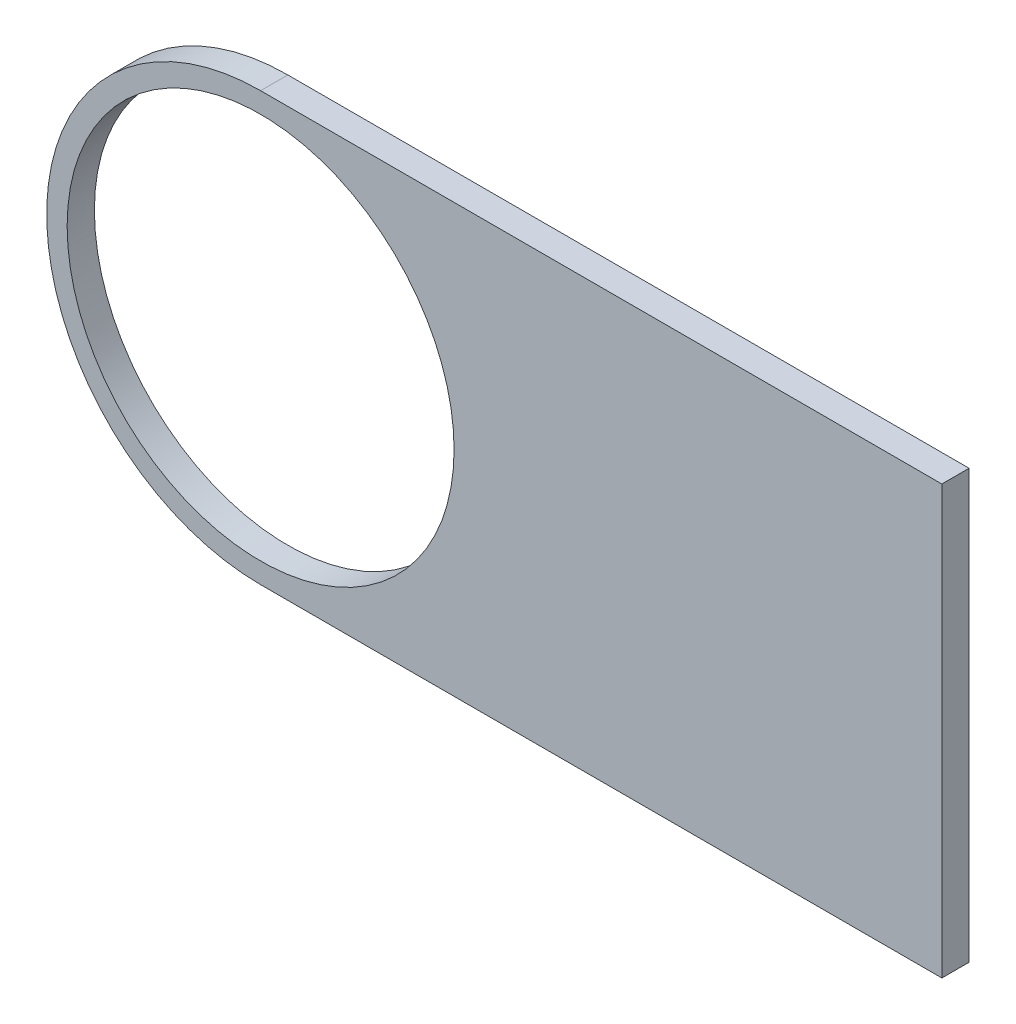
ISO-10303-21;
HEADER;
FILE_DESCRIPTION(('STEP AP214'),'2;1');
FILE_NAME('part.step','',(''),(''),'','','');
FILE_SCHEMA(('AUTOMOTIVE_DESIGN { 1 0 10303 214 1 1 1 1 }'));
ENDSEC;
DATA;
#1=APPLICATION_CONTEXT('core data for automotive mechanical design processes');
#2=APPLICATION_PROTOCOL_DEFINITION('international standard','automotive_design',2000,#1);
#3=PRODUCT_CONTEXT('',#1,'mechanical');
#4=PRODUCT('Part','Part','',(#3));
#5=PRODUCT_RELATED_PRODUCT_CATEGORY('part','',(#4));
#6=PRODUCT_DEFINITION_FORMATION('','',#4);
#7=PRODUCT_DEFINITION_CONTEXT('part definition',#1,'design');
#8=PRODUCT_DEFINITION('design','',#6,#7);
#9=PRODUCT_DEFINITION_SHAPE('','',#8);
#10=(LENGTH_UNIT() NAMED_UNIT(*) SI_UNIT(.MILLI.,.METRE.));
#11=(NAMED_UNIT(*) PLANE_ANGLE_UNIT() SI_UNIT($,.RADIAN.));
#12=(NAMED_UNIT(*) SI_UNIT($,.STERADIAN.) SOLID_ANGLE_UNIT());
#13=UNCERTAINTY_MEASURE_WITH_UNIT(LENGTH_MEASURE(1.E-05),#10,'distance_accuracy_value','');
#14=(GEOMETRIC_REPRESENTATION_CONTEXT(3) GLOBAL_UNCERTAINTY_ASSIGNED_CONTEXT((#13)) GLOBAL_UNIT_ASSIGNED_CONTEXT((#10,
#11,#12)) REPRESENTATION_CONTEXT('',''));
#15=CARTESIAN_POINT('',(0.,0.,0.));
#16=DIRECTION('',(0.,0.,1.));
#17=DIRECTION('',(1.,0.,0.));
#18=AXIS2_PLACEMENT_3D('',#15,#16,#17);
#19=CARTESIAN_POINT('',(0.,0.,2.54));
#20=DIRECTION('',(0.,0.,-1.));
#21=DIRECTION('',(-1.,0.,0.));
#22=AXIS2_PLACEMENT_3D('',#19,#20,#21);
#23=CYLINDRICAL_SURFACE('',#22,19.939);
#24=DIRECTION('',(0.,0.,-1.));
#25=VECTOR('',#24,1.);
#26=CARTESIAN_POINT('',(0.,-19.939,2.54));
#27=LINE('',#26,#25);
#28=CARTESIAN_POINT('',(0.,-19.939,2.54));
#29=VERTEX_POINT('',#28);
#30=CARTESIAN_POINT('',(0.,-19.939,0.));
#31=VERTEX_POINT('',#30);
#32=EDGE_CURVE('E47',#29,#31,#27,.T.);
#33=ORIENTED_EDGE('',*,*,#32,.F.);
#34=CARTESIAN_POINT('',(0.,0.,2.54));
#35=DIRECTION('',(0.,0.,1.));
#36=DIRECTION('',(1.,0.,0.));
#37=AXIS2_PLACEMENT_3D('',#34,#35,#36);
#38=CIRCLE('',#37,19.939);
#39=CARTESIAN_POINT('',(0.,19.939,2.54));
#40=VERTEX_POINT('',#39);
#41=EDGE_CURVE('E11',#40,#29,#38,.T.);
#42=ORIENTED_EDGE('',*,*,#41,.F.);
#43=DIRECTION('',(0.,0.,1.));
#44=VECTOR('',#43,1.);
#45=CARTESIAN_POINT('',(0.,19.939,2.54));
#46=LINE('',#45,#44);
#47=CARTESIAN_POINT('',(0.,19.939,0.));
#48=VERTEX_POINT('',#47);
#49=EDGE_CURVE('E88',#48,#40,#46,.T.);
#50=ORIENTED_EDGE('',*,*,#49,.F.);
#51=CARTESIAN_POINT('',(0.,0.,0.));
#52=DIRECTION('',(0.,0.,1.));
#53=DIRECTION('',(1.,0.,0.));
#54=AXIS2_PLACEMENT_3D('',#51,#52,#53);
#55=CIRCLE('',#54,19.939);
#56=EDGE_CURVE('E36',#48,#31,#55,.T.);
#57=ORIENTED_EDGE('',*,*,#56,.T.);
#58=EDGE_LOOP('',(#33,#42,#50,#57));
#59=FACE_BOUND('',#58,.T.);
#60=ADVANCED_FACE('F33',(#59),#23,.T.);
#61=CARTESIAN_POINT('',(0.,0.,2.54));
#62=DIRECTION('',(0.,0.,1.));
#63=DIRECTION('',(1.,0.,0.));
#64=AXIS2_PLACEMENT_3D('',#61,#62,#63);
#65=PLANE('',#64);
#66=CARTESIAN_POINT('',(0.,0.,2.54));
#67=DIRECTION('',(0.,0.,1.));
#68=DIRECTION('',(1.,0.,0.));
#69=AXIS2_PLACEMENT_3D('',#66,#67,#68);
#70=CIRCLE('',#69,18.034);
#71=CARTESIAN_POINT('',(18.034,0.,2.54));
#72=VERTEX_POINT('',#71);
#73=EDGE_CURVE('E105',#72,#72,#70,.T.);
#74=ORIENTED_EDGE('',*,*,#73,.F.);
#75=EDGE_LOOP('',(#74));
#76=FACE_BOUND('',#75,.T.);
#77=ORIENTED_EDGE('',*,*,#41,.T.);
#78=DIRECTION('',(-1.,0.,0.));
#79=VECTOR('',#78,1.);
#80=CARTESIAN_POINT('',(63.5,-19.939,2.54));
#81=LINE('',#80,#79);
#82=CARTESIAN_POINT('',(63.5,-19.939,2.54));
#83=VERTEX_POINT('',#82);
#84=EDGE_CURVE('E73',#83,#29,#81,.T.);
#85=ORIENTED_EDGE('',*,*,#84,.F.);
#86=DIRECTION('',(0.,-1.,0.));
#87=VECTOR('',#86,1.);
#88=CARTESIAN_POINT('',(63.5,19.939,2.54));
#89=LINE('',#88,#87);
#90=CARTESIAN_POINT('',(63.5,19.939,2.54));
#91=VERTEX_POINT('',#90);
#92=EDGE_CURVE('E79',#91,#83,#89,.T.);
#93=ORIENTED_EDGE('',*,*,#92,.F.);
#94=DIRECTION('',(-1.,0.,0.));
#95=VECTOR('',#94,1.);
#96=CARTESIAN_POINT('',(63.5,19.939,2.54));
#97=LINE('',#96,#95);
#98=EDGE_CURVE('E97',#91,#40,#97,.T.);
#99=ORIENTED_EDGE('',*,*,#98,.T.);
#100=EDGE_LOOP('',(#77,#85,#93,#99));
#101=FACE_BOUND('',#100,.T.);
#102=ADVANCED_FACE('F90',(#76,#101),#65,.T.);
#103=CARTESIAN_POINT('',(0.,0.,0.));
#104=DIRECTION('',(0.,0.,1.));
#105=DIRECTION('',(1.,0.,0.));
#106=AXIS2_PLACEMENT_3D('',#103,#104,#105);
#107=PLANE('',#106);
#108=CARTESIAN_POINT('',(0.,0.,0.));
#109=DIRECTION('',(0.,0.,1.));
#110=DIRECTION('',(1.,0.,0.));
#111=AXIS2_PLACEMENT_3D('',#108,#109,#110);
#112=CIRCLE('',#111,18.034);
#113=CARTESIAN_POINT('',(18.034,0.,0.));
#114=VERTEX_POINT('',#113);
#115=EDGE_CURVE('E102',#114,#114,#112,.T.);
#116=ORIENTED_EDGE('',*,*,#115,.T.);
#117=EDGE_LOOP('',(#116));
#118=FACE_BOUND('',#117,.T.);
#119=ORIENTED_EDGE('',*,*,#56,.F.);
#120=DIRECTION('',(-1.,0.,0.));
#121=VECTOR('',#120,1.);
#122=CARTESIAN_POINT('',(63.5,19.939,0.));
#123=LINE('',#122,#121);
#124=CARTESIAN_POINT('',(63.5,19.939,0.));
#125=VERTEX_POINT('',#124);
#126=EDGE_CURVE('E92',#125,#48,#123,.T.);
#127=ORIENTED_EDGE('',*,*,#126,.F.);
#128=DIRECTION('',(0.,1.,0.));
#129=VECTOR('',#128,1.);
#130=CARTESIAN_POINT('',(63.5,19.939,0.));
#131=LINE('',#130,#129);
#132=CARTESIAN_POINT('',(63.5,-19.939,0.));
#133=VERTEX_POINT('',#132);
#134=EDGE_CURVE('E78',#133,#125,#131,.T.);
#135=ORIENTED_EDGE('',*,*,#134,.F.);
#136=DIRECTION('',(-1.,0.,0.));
#137=VECTOR('',#136,1.);
#138=CARTESIAN_POINT('',(63.5,-19.939,0.));
#139=LINE('',#138,#137);
#140=EDGE_CURVE('E75',#133,#31,#139,.T.);
#141=ORIENTED_EDGE('',*,*,#140,.T.);
#142=EDGE_LOOP('',(#119,#127,#135,#141));
#143=FACE_BOUND('',#142,.T.);
#144=ADVANCED_FACE('F111',(#118,#143),#107,.F.);
#145=CARTESIAN_POINT('',(63.5,-19.939,2.54));
#146=DIRECTION('',(0.,1.,0.));
#147=DIRECTION('',(0.,0.,1.));
#148=AXIS2_PLACEMENT_3D('',#145,#146,#147);
#149=PLANE('',#148);
#150=ORIENTED_EDGE('',*,*,#32,.T.);
#151=ORIENTED_EDGE('',*,*,#140,.F.);
#152=DIRECTION('',(0.,0.,-1.));
#153=VECTOR('',#152,1.);
#154=CARTESIAN_POINT('',(63.5,-19.939,2.54));
#155=LINE('',#154,#153);
#156=EDGE_CURVE('E69',#83,#133,#155,.T.);
#157=ORIENTED_EDGE('',*,*,#156,.F.);
#158=ORIENTED_EDGE('',*,*,#84,.T.);
#159=EDGE_LOOP('',(#150,#151,#157,#158));
#160=FACE_BOUND('',#159,.T.);
#161=ADVANCED_FACE('F71',(#160),#149,.F.);
#162=CARTESIAN_POINT('',(63.5,19.939,2.54));
#163=DIRECTION('',(0.,-1.,0.));
#164=DIRECTION('',(0.,0.,-1.));
#165=AXIS2_PLACEMENT_3D('',#162,#163,#164);
#166=PLANE('',#165);
#167=ORIENTED_EDGE('',*,*,#49,.T.);
#168=ORIENTED_EDGE('',*,*,#98,.F.);
#169=DIRECTION('',(0.,0.,1.));
#170=VECTOR('',#169,1.);
#171=CARTESIAN_POINT('',(63.5,19.939,2.54));
#172=LINE('',#171,#170);
#173=EDGE_CURVE('E84',#125,#91,#172,.T.);
#174=ORIENTED_EDGE('',*,*,#173,.F.);
#175=ORIENTED_EDGE('',*,*,#126,.T.);
#176=EDGE_LOOP('',(#167,#168,#174,#175));
#177=FACE_BOUND('',#176,.T.);
#178=ADVANCED_FACE('F129',(#177),#166,.F.);
#179=CARTESIAN_POINT('',(63.5,0.,0.));
#180=DIRECTION('',(1.,0.,0.));
#181=DIRECTION('',(0.,0.,-1.));
#182=AXIS2_PLACEMENT_3D('',#179,#180,#181);
#183=PLANE('',#182);
#184=ORIENTED_EDGE('',*,*,#92,.T.);
#185=ORIENTED_EDGE('',*,*,#156,.T.);
#186=ORIENTED_EDGE('',*,*,#134,.T.);
#187=ORIENTED_EDGE('',*,*,#173,.T.);
#188=EDGE_LOOP('',(#184,#185,#186,#187));
#189=FACE_BOUND('',#188,.T.);
#190=ADVANCED_FACE('F82',(#189),#183,.T.);
#191=CARTESIAN_POINT('',(0.,0.,0.));
#192=DIRECTION('',(0.,0.,1.));
#193=DIRECTION('',(1.,0.,0.));
#194=AXIS2_PLACEMENT_3D('',#191,#192,#193);
#195=CYLINDRICAL_SURFACE('',#194,18.034);
#196=ORIENTED_EDGE('',*,*,#115,.F.);
#197=EDGE_LOOP('',(#196));
#198=FACE_BOUND('',#197,.T.);
#199=ORIENTED_EDGE('',*,*,#73,.T.);
#200=EDGE_LOOP('',(#199));
#201=FACE_BOUND('',#200,.T.);
#202=ADVANCED_FACE('F114',(#198,#201),#195,.F.);
#203=CLOSED_SHELL('',(#60,#102,#144,#161,#178,#190,#202));
#204=MANIFOLD_SOLID_BREP('B2',#203);
#205=ADVANCED_BREP_SHAPE_REPRESENTATION('',(#18,#204),#14);
#206=SHAPE_DEFINITION_REPRESENTATION(#9,#205);
ENDSEC;
END-ISO-10303-21;
